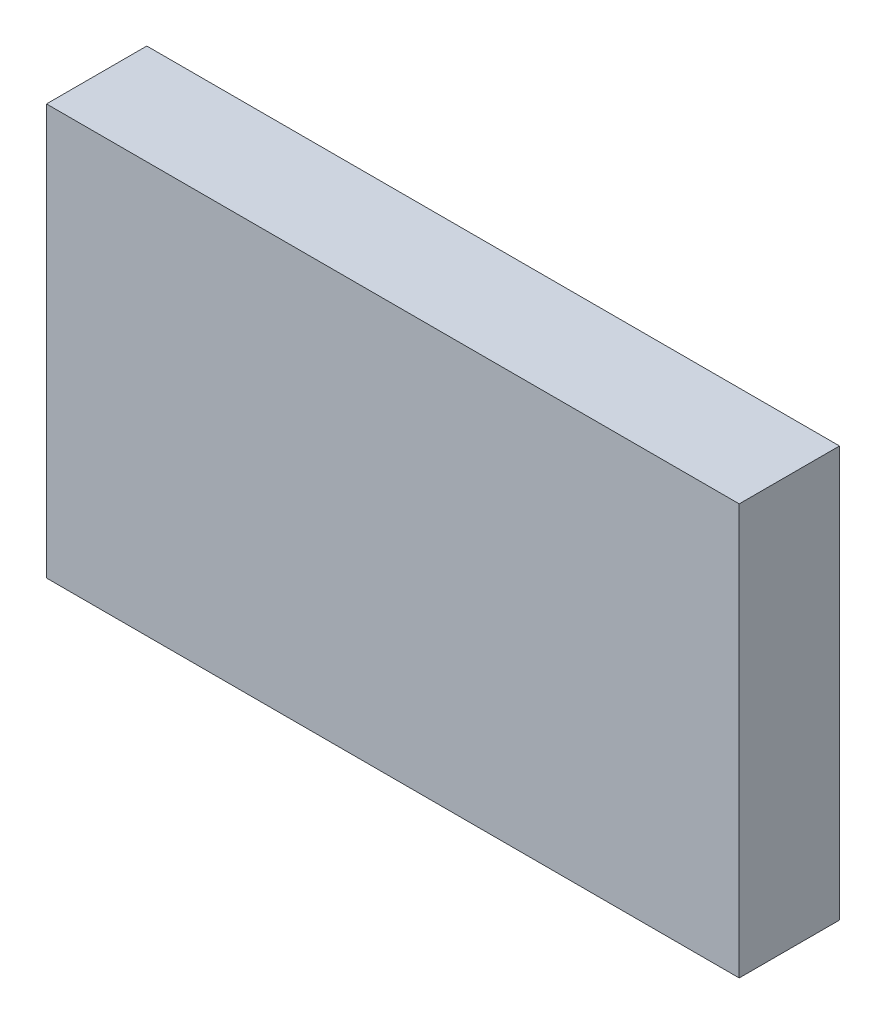
ISO-10303-21;
HEADER;
FILE_DESCRIPTION(('STEP AP214'),'2;1');
FILE_NAME('part.step','',(''),(''),'','','');
FILE_SCHEMA(('AUTOMOTIVE_DESIGN { 1 0 10303 214 1 1 1 1 }'));
ENDSEC;
DATA;
#1=APPLICATION_CONTEXT('core data for automotive mechanical design processes');
#2=APPLICATION_PROTOCOL_DEFINITION('international standard','automotive_design',2000,#1);
#3=PRODUCT_CONTEXT('',#1,'mechanical');
#4=PRODUCT('Part','Part','',(#3));
#5=PRODUCT_RELATED_PRODUCT_CATEGORY('part','',(#4));
#6=PRODUCT_DEFINITION_FORMATION('','',#4);
#7=PRODUCT_DEFINITION_CONTEXT('part definition',#1,'design');
#8=PRODUCT_DEFINITION('design','',#6,#7);
#9=PRODUCT_DEFINITION_SHAPE('','',#8);
#10=(LENGTH_UNIT() NAMED_UNIT(*) SI_UNIT(.MILLI.,.METRE.));
#11=(NAMED_UNIT(*) PLANE_ANGLE_UNIT() SI_UNIT($,.RADIAN.));
#12=(NAMED_UNIT(*) SI_UNIT($,.STERADIAN.) SOLID_ANGLE_UNIT());
#13=UNCERTAINTY_MEASURE_WITH_UNIT(LENGTH_MEASURE(1.E-05),#10,'distance_accuracy_value','');
#14=(GEOMETRIC_REPRESENTATION_CONTEXT(3) GLOBAL_UNCERTAINTY_ASSIGNED_CONTEXT((#13)) GLOBAL_UNIT_ASSIGNED_CONTEXT((#10,
#11,#12)) REPRESENTATION_CONTEXT('',''));
#15=CARTESIAN_POINT('',(0.,0.,0.));
#16=DIRECTION('',(0.,0.,1.));
#17=DIRECTION('',(1.,0.,0.));
#18=AXIS2_PLACEMENT_3D('',#15,#16,#17);
#19=CARTESIAN_POINT('',(11.05,-6.55,3.2));
#20=DIRECTION('',(-1.,0.,0.));
#21=DIRECTION('',(0.,0.,1.));
#22=AXIS2_PLACEMENT_3D('',#19,#20,#21);
#23=PLANE('',#22);
#24=DIRECTION('',(0.,1.,0.));
#25=VECTOR('',#24,1.);
#26=CARTESIAN_POINT('',(11.05,-6.55,0.));
#27=LINE('',#26,#25);
#28=CARTESIAN_POINT('',(11.05,-6.55,0.));
#29=VERTEX_POINT('',#28);
#30=CARTESIAN_POINT('',(11.05,6.55,0.));
#31=VERTEX_POINT('',#30);
#32=EDGE_CURVE('E96',#29,#31,#27,.T.);
#33=ORIENTED_EDGE('',*,*,#32,.T.);
#34=DIRECTION('',(0.,0.,-1.));
#35=VECTOR('',#34,1.);
#36=CARTESIAN_POINT('',(11.05,6.55,3.2));
#37=LINE('',#36,#35);
#38=CARTESIAN_POINT('',(11.05,6.55,3.2));
#39=VERTEX_POINT('',#38);
#40=EDGE_CURVE('E11',#39,#31,#37,.T.);
#41=ORIENTED_EDGE('',*,*,#40,.F.);
#42=DIRECTION('',(0.,1.,0.));
#43=VECTOR('',#42,1.);
#44=CARTESIAN_POINT('',(11.05,-6.55,3.2));
#45=LINE('',#44,#43);
#46=CARTESIAN_POINT('',(11.05,-6.55,3.2));
#47=VERTEX_POINT('',#46);
#48=EDGE_CURVE('E84',#47,#39,#45,.T.);
#49=ORIENTED_EDGE('',*,*,#48,.F.);
#50=DIRECTION('',(0.,0.,-1.));
#51=VECTOR('',#50,1.);
#52=CARTESIAN_POINT('',(11.05,-6.55,3.2));
#53=LINE('',#52,#51);
#54=EDGE_CURVE('E92',#47,#29,#53,.T.);
#55=ORIENTED_EDGE('',*,*,#54,.T.);
#56=EDGE_LOOP('',(#33,#41,#49,#55));
#57=FACE_BOUND('',#56,.T.);
#58=ADVANCED_FACE('F33',(#57),#23,.F.);
#59=CARTESIAN_POINT('',(-11.05,6.55,3.2));
#60=DIRECTION('',(0.,-1.,0.));
#61=DIRECTION('',(0.,0.,-1.));
#62=AXIS2_PLACEMENT_3D('',#59,#60,#61);
#63=PLANE('',#62);
#64=DIRECTION('',(-1.,0.,0.));
#65=VECTOR('',#64,1.);
#66=CARTESIAN_POINT('',(-11.05,6.55,0.));
#67=LINE('',#66,#65);
#68=CARTESIAN_POINT('',(-11.05,6.55,0.));
#69=VERTEX_POINT('',#68);
#70=EDGE_CURVE('E88',#31,#69,#67,.T.);
#71=ORIENTED_EDGE('',*,*,#70,.T.);
#72=DIRECTION('',(0.,0.,-1.));
#73=VECTOR('',#72,1.);
#74=CARTESIAN_POINT('',(-11.05,6.55,3.2));
#75=LINE('',#74,#73);
#76=CARTESIAN_POINT('',(-11.05,6.55,3.2));
#77=VERTEX_POINT('',#76);
#78=EDGE_CURVE('E41',#77,#69,#75,.T.);
#79=ORIENTED_EDGE('',*,*,#78,.F.);
#80=DIRECTION('',(-1.,0.,0.));
#81=VECTOR('',#80,1.);
#82=CARTESIAN_POINT('',(-11.05,6.55,3.2));
#83=LINE('',#82,#81);
#84=EDGE_CURVE('E79',#39,#77,#83,.T.);
#85=ORIENTED_EDGE('',*,*,#84,.F.);
#86=ORIENTED_EDGE('',*,*,#40,.T.);
#87=EDGE_LOOP('',(#71,#79,#85,#86));
#88=FACE_BOUND('',#87,.T.);
#89=ADVANCED_FACE('F87',(#88),#63,.F.);
#90=CARTESIAN_POINT('',(-11.05,-6.55,3.2));
#91=DIRECTION('',(1.,0.,0.));
#92=DIRECTION('',(0.,0.,-1.));
#93=AXIS2_PLACEMENT_3D('',#90,#91,#92);
#94=PLANE('',#93);
#95=DIRECTION('',(0.,-1.,0.));
#96=VECTOR('',#95,1.);
#97=CARTESIAN_POINT('',(-11.05,-6.55,0.));
#98=LINE('',#97,#96);
#99=CARTESIAN_POINT('',(-11.05,-6.55,0.));
#100=VERTEX_POINT('',#99);
#101=EDGE_CURVE('E66',#69,#100,#98,.T.);
#102=ORIENTED_EDGE('',*,*,#101,.T.);
#103=DIRECTION('',(0.,0.,-1.));
#104=VECTOR('',#103,1.);
#105=CARTESIAN_POINT('',(-11.05,-6.55,3.2));
#106=LINE('',#105,#104);
#107=CARTESIAN_POINT('',(-11.05,-6.55,3.2));
#108=VERTEX_POINT('',#107);
#109=EDGE_CURVE('E89',#108,#100,#106,.T.);
#110=ORIENTED_EDGE('',*,*,#109,.F.);
#111=DIRECTION('',(0.,-1.,0.));
#112=VECTOR('',#111,1.);
#113=CARTESIAN_POINT('',(-11.05,-6.55,3.2));
#114=LINE('',#113,#112);
#115=EDGE_CURVE('E82',#77,#108,#114,.T.);
#116=ORIENTED_EDGE('',*,*,#115,.F.);
#117=ORIENTED_EDGE('',*,*,#78,.T.);
#118=EDGE_LOOP('',(#102,#110,#116,#117));
#119=FACE_BOUND('',#118,.T.);
#120=ADVANCED_FACE('F90',(#119),#94,.F.);
#121=CARTESIAN_POINT('',(-11.05,-6.55,3.2));
#122=DIRECTION('',(0.,1.,0.));
#123=DIRECTION('',(0.,0.,1.));
#124=AXIS2_PLACEMENT_3D('',#121,#122,#123);
#125=PLANE('',#124);
#126=DIRECTION('',(1.,0.,0.));
#127=VECTOR('',#126,1.);
#128=CARTESIAN_POINT('',(-11.05,-6.55,0.));
#129=LINE('',#128,#127);
#130=EDGE_CURVE('E72',#100,#29,#129,.T.);
#131=ORIENTED_EDGE('',*,*,#130,.T.);
#132=ORIENTED_EDGE('',*,*,#54,.F.);
#133=DIRECTION('',(1.,0.,0.));
#134=VECTOR('',#133,1.);
#135=CARTESIAN_POINT('',(-11.05,-6.55,3.2));
#136=LINE('',#135,#134);
#137=EDGE_CURVE('E49',#108,#47,#136,.T.);
#138=ORIENTED_EDGE('',*,*,#137,.F.);
#139=ORIENTED_EDGE('',*,*,#109,.T.);
#140=EDGE_LOOP('',(#131,#132,#138,#139));
#141=FACE_BOUND('',#140,.T.);
#142=ADVANCED_FACE('F103',(#141),#125,.F.);
#143=CARTESIAN_POINT('',(0.,0.,3.2));
#144=DIRECTION('',(0.,0.,-1.));
#145=DIRECTION('',(-1.,0.,0.));
#146=AXIS2_PLACEMENT_3D('',#143,#144,#145);
#147=PLANE('',#146);
#148=ORIENTED_EDGE('',*,*,#48,.T.);
#149=ORIENTED_EDGE('',*,*,#84,.T.);
#150=ORIENTED_EDGE('',*,*,#115,.T.);
#151=ORIENTED_EDGE('',*,*,#137,.T.);
#152=EDGE_LOOP('',(#148,#149,#150,#151));
#153=FACE_BOUND('',#152,.T.);
#154=ADVANCED_FACE('F80',(#153),#147,.F.);
#155=CARTESIAN_POINT('',(0.,0.,0.));
#156=DIRECTION('',(0.,0.,-1.));
#157=DIRECTION('',(-1.,0.,0.));
#158=AXIS2_PLACEMENT_3D('',#155,#156,#157);
#159=PLANE('',#158);
#160=ORIENTED_EDGE('',*,*,#32,.F.);
#161=ORIENTED_EDGE('',*,*,#130,.F.);
#162=ORIENTED_EDGE('',*,*,#101,.F.);
#163=ORIENTED_EDGE('',*,*,#70,.F.);
#164=EDGE_LOOP('',(#160,#161,#162,#163));
#165=FACE_BOUND('',#164,.T.);
#166=ADVANCED_FACE('F106',(#165),#159,.T.);
#167=CLOSED_SHELL('',(#58,#89,#120,#142,#154,#166));
#168=MANIFOLD_SOLID_BREP('B2',#167);
#169=ADVANCED_BREP_SHAPE_REPRESENTATION('',(#18,#168),#14);
#170=SHAPE_DEFINITION_REPRESENTATION(#9,#169);
ENDSEC;
END-ISO-10303-21;
